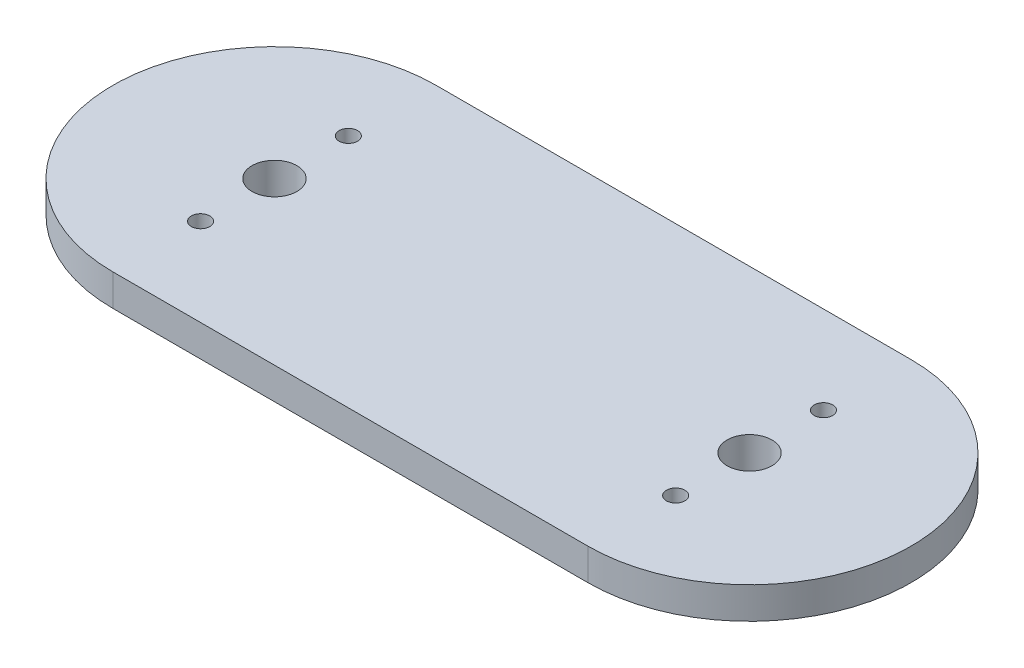
ISO-10303-21;
HEADER;
FILE_DESCRIPTION(('STEP AP214'),'2;1');
FILE_NAME('part.step','',(''),(''),'','','');
FILE_SCHEMA(('AUTOMOTIVE_DESIGN { 1 0 10303 214 1 1 1 1 }'));
ENDSEC;
DATA;
#1=APPLICATION_CONTEXT('core data for automotive mechanical design processes');
#2=APPLICATION_PROTOCOL_DEFINITION('international standard','automotive_design',2000,#1);
#3=PRODUCT_CONTEXT('',#1,'mechanical');
#4=PRODUCT('Part','Part','',(#3));
#5=PRODUCT_RELATED_PRODUCT_CATEGORY('part','',(#4));
#6=PRODUCT_DEFINITION_FORMATION('','',#4);
#7=PRODUCT_DEFINITION_CONTEXT('part definition',#1,'design');
#8=PRODUCT_DEFINITION('design','',#6,#7);
#9=PRODUCT_DEFINITION_SHAPE('','',#8);
#10=(LENGTH_UNIT() NAMED_UNIT(*) SI_UNIT(.MILLI.,.METRE.));
#11=(NAMED_UNIT(*) PLANE_ANGLE_UNIT() SI_UNIT($,.RADIAN.));
#12=(NAMED_UNIT(*) SI_UNIT($,.STERADIAN.) SOLID_ANGLE_UNIT());
#13=UNCERTAINTY_MEASURE_WITH_UNIT(LENGTH_MEASURE(1.E-05),#10,'distance_accuracy_value','');
#14=(GEOMETRIC_REPRESENTATION_CONTEXT(3) GLOBAL_UNCERTAINTY_ASSIGNED_CONTEXT((#13)) GLOBAL_UNIT_ASSIGNED_CONTEXT((#10,
#11,#12)) REPRESENTATION_CONTEXT('',''));
#15=CARTESIAN_POINT('',(0.,0.,0.));
#16=DIRECTION('',(0.,0.,1.));
#17=DIRECTION('',(1.,0.,0.));
#18=AXIS2_PLACEMENT_3D('',#15,#16,#17);
#19=CARTESIAN_POINT('',(-31.9723183391004,3.,15.30530954));
#20=DIRECTION('',(0.,-1.,0.));
#21=DIRECTION('',(0.,0.,-1.));
#22=AXIS2_PLACEMENT_3D('',#19,#20,#21);
#23=CYLINDRICAL_SURFACE('',#22,15.30530954);
#24=CARTESIAN_POINT('',(-31.9723183391004,0.,15.30530954));
#25=DIRECTION('',(0.,1.,0.));
#26=DIRECTION('',(0.,0.,-1.));
#27=AXIS2_PLACEMENT_3D('',#24,#25,#26);
#28=CIRCLE('',#27,15.30530954);
#29=CARTESIAN_POINT('',(-31.9723183391004,0.,0.));
#30=VERTEX_POINT('',#29);
#31=CARTESIAN_POINT('',(-31.9723183391004,0.,30.61061908));
#32=VERTEX_POINT('',#31);
#33=EDGE_CURVE('E107',#30,#32,#28,.T.);
#34=ORIENTED_EDGE('',*,*,#33,.T.);
#35=DIRECTION('',(0.,-1.,0.));
#36=VECTOR('',#35,1.);
#37=CARTESIAN_POINT('',(-31.9723183391004,3.,30.61061908));
#38=LINE('',#37,#36);
#39=CARTESIAN_POINT('',(-31.9723183391004,3.,30.61061908));
#40=VERTEX_POINT('',#39);
#41=EDGE_CURVE('E11',#40,#32,#38,.T.);
#42=ORIENTED_EDGE('',*,*,#41,.F.);
#43=CARTESIAN_POINT('',(-31.9723183391004,3.,15.30530954));
#44=DIRECTION('',(0.,1.,0.));
#45=DIRECTION('',(0.,0.,-1.));
#46=AXIS2_PLACEMENT_3D('',#43,#44,#45);
#47=CIRCLE('',#46,15.30530954);
#48=CARTESIAN_POINT('',(-31.9723183391004,3.,0.));
#49=VERTEX_POINT('',#48);
#50=EDGE_CURVE('E91',#49,#40,#47,.T.);
#51=ORIENTED_EDGE('',*,*,#50,.F.);
#52=DIRECTION('',(0.,-1.,0.));
#53=VECTOR('',#52,1.);
#54=CARTESIAN_POINT('',(-31.9723183391004,3.,0.));
#55=LINE('',#54,#53);
#56=EDGE_CURVE('E103',#49,#30,#55,.T.);
#57=ORIENTED_EDGE('',*,*,#56,.T.);
#58=EDGE_LOOP('',(#34,#42,#51,#57));
#59=FACE_BOUND('',#58,.T.);
#60=ADVANCED_FACE('F39',(#59),#23,.T.);
#61=CARTESIAN_POINT('',(13.0276816608996,3.,30.61061908));
#62=DIRECTION('',(0.,0.,-1.));
#63=DIRECTION('',(-1.,0.,0.));
#64=AXIS2_PLACEMENT_3D('',#61,#62,#63);
#65=PLANE('',#64);
#66=DIRECTION('',(1.,0.,0.));
#67=VECTOR('',#66,1.);
#68=CARTESIAN_POINT('',(13.0276816608996,0.,30.61061908));
#69=LINE('',#68,#67);
#70=CARTESIAN_POINT('',(13.0276816608996,0.,30.61061908));
#71=VERTEX_POINT('',#70);
#72=EDGE_CURVE('E96',#32,#71,#69,.T.);
#73=ORIENTED_EDGE('',*,*,#72,.T.);
#74=DIRECTION('',(0.,-1.,0.));
#75=VECTOR('',#74,1.);
#76=CARTESIAN_POINT('',(13.0276816608996,3.,30.61061908));
#77=LINE('',#76,#75);
#78=CARTESIAN_POINT('',(13.0276816608996,3.,30.61061908));
#79=VERTEX_POINT('',#78);
#80=EDGE_CURVE('E48',#79,#71,#77,.T.);
#81=ORIENTED_EDGE('',*,*,#80,.F.);
#82=DIRECTION('',(1.,0.,0.));
#83=VECTOR('',#82,1.);
#84=CARTESIAN_POINT('',(13.0276816608996,3.,30.61061908));
#85=LINE('',#84,#83);
#86=EDGE_CURVE('E86',#40,#79,#85,.T.);
#87=ORIENTED_EDGE('',*,*,#86,.F.);
#88=ORIENTED_EDGE('',*,*,#41,.T.);
#89=EDGE_LOOP('',(#73,#81,#87,#88));
#90=FACE_BOUND('',#89,.T.);
#91=ADVANCED_FACE('F95',(#90),#65,.F.);
#92=CARTESIAN_POINT('',(13.0276816608996,3.,15.30530954));
#93=DIRECTION('',(0.,-1.,0.));
#94=DIRECTION('',(0.,0.,-1.));
#95=AXIS2_PLACEMENT_3D('',#92,#93,#94);
#96=CYLINDRICAL_SURFACE('',#95,15.30530954);
#97=CARTESIAN_POINT('',(13.0276816608996,0.,15.30530954));
#98=DIRECTION('',(0.,1.,0.));
#99=DIRECTION('',(0.,0.,-1.));
#100=AXIS2_PLACEMENT_3D('',#97,#98,#99);
#101=CIRCLE('',#100,15.30530954);
#102=CARTESIAN_POINT('',(13.0276816608996,0.,0.));
#103=VERTEX_POINT('',#102);
#104=EDGE_CURVE('E73',#71,#103,#101,.T.);
#105=ORIENTED_EDGE('',*,*,#104,.T.);
#106=DIRECTION('',(0.,-1.,0.));
#107=VECTOR('',#106,1.);
#108=CARTESIAN_POINT('',(13.0276816608996,3.,0.));
#109=LINE('',#108,#107);
#110=CARTESIAN_POINT('',(13.0276816608996,3.,0.));
#111=VERTEX_POINT('',#110);
#112=EDGE_CURVE('E98',#111,#103,#109,.T.);
#113=ORIENTED_EDGE('',*,*,#112,.F.);
#114=CARTESIAN_POINT('',(13.0276816608996,3.,15.30530954));
#115=DIRECTION('',(0.,1.,0.));
#116=DIRECTION('',(0.,0.,-1.));
#117=AXIS2_PLACEMENT_3D('',#114,#115,#116);
#118=CIRCLE('',#117,15.30530954);
#119=EDGE_CURVE('E89',#79,#111,#118,.T.);
#120=ORIENTED_EDGE('',*,*,#119,.F.);
#121=ORIENTED_EDGE('',*,*,#80,.T.);
#122=EDGE_LOOP('',(#105,#113,#120,#121));
#123=FACE_BOUND('',#122,.T.);
#124=ADVANCED_FACE('F99',(#123),#96,.T.);
#125=CARTESIAN_POINT('',(-31.9723183391004,3.,0.));
#126=DIRECTION('',(0.,0.,1.));
#127=DIRECTION('',(1.,0.,0.));
#128=AXIS2_PLACEMENT_3D('',#125,#126,#127);
#129=PLANE('',#128);
#130=DIRECTION('',(-1.,0.,0.));
#131=VECTOR('',#130,1.);
#132=CARTESIAN_POINT('',(-31.9723183391004,0.,0.));
#133=LINE('',#132,#131);
#134=EDGE_CURVE('E79',#103,#30,#133,.T.);
#135=ORIENTED_EDGE('',*,*,#134,.T.);
#136=ORIENTED_EDGE('',*,*,#56,.F.);
#137=DIRECTION('',(-1.,0.,0.));
#138=VECTOR('',#137,1.);
#139=CARTESIAN_POINT('',(-31.9723183391004,3.,0.));
#140=LINE('',#139,#138);
#141=EDGE_CURVE('E56',#111,#49,#140,.T.);
#142=ORIENTED_EDGE('',*,*,#141,.F.);
#143=ORIENTED_EDGE('',*,*,#112,.T.);
#144=EDGE_LOOP('',(#135,#136,#142,#143));
#145=FACE_BOUND('',#144,.T.);
#146=ADVANCED_FACE('F121',(#145),#129,.F.);
#147=CARTESIAN_POINT('',(-31.9723183391004,3.,15.30530954));
#148=DIRECTION('',(0.,-1.,0.));
#149=DIRECTION('',(0.,0.,-1.));
#150=AXIS2_PLACEMENT_3D('',#147,#148,#149);
#151=PLANE('',#150);
#152=CARTESIAN_POINT('',(-31.9723183391004,3.,8.30530954));
#153=DIRECTION('',(0.,1.,0.));
#154=DIRECTION('',(0.,0.,1.));
#155=AXIS2_PLACEMENT_3D('',#152,#153,#154);
#156=CIRCLE('',#155,0.875000000000002);
#157=CARTESIAN_POINT('',(-31.9723183391004,3.,9.18030954));
#158=VERTEX_POINT('',#157);
#159=EDGE_CURVE('E161',#158,#158,#156,.T.);
#160=ORIENTED_EDGE('',*,*,#159,.F.);
#161=EDGE_LOOP('',(#160));
#162=FACE_BOUND('',#161,.T.);
#163=CARTESIAN_POINT('',(-31.9723183391004,3.,22.30530954));
#164=DIRECTION('',(0.,1.,0.));
#165=DIRECTION('',(0.,0.,-1.));
#166=AXIS2_PLACEMENT_3D('',#163,#164,#165);
#167=CIRCLE('',#166,0.875000000000002);
#168=CARTESIAN_POINT('',(-31.9723183391004,3.,21.43030954));
#169=VERTEX_POINT('',#168);
#170=EDGE_CURVE('E153',#169,#169,#167,.T.);
#171=ORIENTED_EDGE('',*,*,#170,.F.);
#172=EDGE_LOOP('',(#171));
#173=FACE_BOUND('',#172,.T.);
#174=CARTESIAN_POINT('',(13.0276816608996,3.,8.30530954));
#175=DIRECTION('',(0.,1.,0.));
#176=DIRECTION('',(0.,0.,-1.));
#177=AXIS2_PLACEMENT_3D('',#174,#175,#176);
#178=CIRCLE('',#177,0.875);
#179=CARTESIAN_POINT('',(13.0276816608996,3.,7.43030954));
#180=VERTEX_POINT('',#179);
#181=EDGE_CURVE('E145',#180,#180,#178,.T.);
#182=ORIENTED_EDGE('',*,*,#181,.F.);
#183=EDGE_LOOP('',(#182));
#184=FACE_BOUND('',#183,.T.);
#185=CARTESIAN_POINT('',(13.0276816608996,3.,15.30530954));
#186=DIRECTION('',(0.,1.,0.));
#187=DIRECTION('',(0.,0.,-1.));
#188=AXIS2_PLACEMENT_3D('',#185,#186,#187);
#189=CIRCLE('',#188,2.125);
#190=CARTESIAN_POINT('',(13.0276816608996,3.,13.18030954));
#191=VERTEX_POINT('',#190);
#192=EDGE_CURVE('E136',#191,#191,#189,.T.);
#193=ORIENTED_EDGE('',*,*,#192,.F.);
#194=EDGE_LOOP('',(#193));
#195=FACE_BOUND('',#194,.T.);
#196=CARTESIAN_POINT('',(13.0276816608996,3.,22.30530954));
#197=DIRECTION('',(0.,1.,0.));
#198=DIRECTION('',(0.,0.,1.));
#199=AXIS2_PLACEMENT_3D('',#196,#197,#198);
#200=CIRCLE('',#199,0.875);
#201=CARTESIAN_POINT('',(13.0276816608996,3.,23.18030954));
#202=VERTEX_POINT('',#201);
#203=EDGE_CURVE('E168',#202,#202,#200,.T.);
#204=ORIENTED_EDGE('',*,*,#203,.F.);
#205=EDGE_LOOP('',(#204));
#206=FACE_BOUND('',#205,.T.);
#207=CARTESIAN_POINT('',(-31.9723183391004,3.,15.30530954));
#208=DIRECTION('',(0.,1.,0.));
#209=DIRECTION('',(0.,0.,1.));
#210=AXIS2_PLACEMENT_3D('',#207,#208,#209);
#211=CIRCLE('',#210,2.125);
#212=CARTESIAN_POINT('',(-31.9723183391004,3.,17.43030954));
#213=VERTEX_POINT('',#212);
#214=EDGE_CURVE('E128',#213,#213,#211,.T.);
#215=ORIENTED_EDGE('',*,*,#214,.F.);
#216=EDGE_LOOP('',(#215));
#217=FACE_BOUND('',#216,.T.);
#218=ORIENTED_EDGE('',*,*,#50,.T.);
#219=ORIENTED_EDGE('',*,*,#86,.T.);
#220=ORIENTED_EDGE('',*,*,#119,.T.);
#221=ORIENTED_EDGE('',*,*,#141,.T.);
#222=EDGE_LOOP('',(#218,#219,#220,#221));
#223=FACE_BOUND('',#222,.T.);
#224=ADVANCED_FACE('F87',(#162,#173,#184,#195,#206,#217,#223),#151,.F.);
#225=CARTESIAN_POINT('',(-31.9723183391004,0.,15.30530954));
#226=DIRECTION('',(0.,-1.,0.));
#227=DIRECTION('',(0.,0.,-1.));
#228=AXIS2_PLACEMENT_3D('',#225,#226,#227);
#229=PLANE('',#228);
#230=CARTESIAN_POINT('',(-31.9723183391004,0.,8.30530954));
#231=DIRECTION('',(0.,1.,0.));
#232=DIRECTION('',(0.,0.,1.));
#233=AXIS2_PLACEMENT_3D('',#230,#231,#232);
#234=CIRCLE('',#233,0.875000000000002);
#235=CARTESIAN_POINT('',(-31.9723183391004,0.,9.18030954));
#236=VERTEX_POINT('',#235);
#237=EDGE_CURVE('E132',#236,#236,#234,.T.);
#238=ORIENTED_EDGE('',*,*,#237,.T.);
#239=EDGE_LOOP('',(#238));
#240=FACE_BOUND('',#239,.T.);
#241=CARTESIAN_POINT('',(-31.9723183391004,0.,22.30530954));
#242=DIRECTION('',(0.,1.,0.));
#243=DIRECTION('',(0.,0.,-1.));
#244=AXIS2_PLACEMENT_3D('',#241,#242,#243);
#245=CIRCLE('',#244,0.875000000000002);
#246=CARTESIAN_POINT('',(-31.9723183391004,0.,21.43030954));
#247=VERTEX_POINT('',#246);
#248=EDGE_CURVE('E157',#247,#247,#245,.T.);
#249=ORIENTED_EDGE('',*,*,#248,.T.);
#250=EDGE_LOOP('',(#249));
#251=FACE_BOUND('',#250,.T.);
#252=CARTESIAN_POINT('',(13.0276816608996,0.,8.30530954));
#253=DIRECTION('',(0.,1.,0.));
#254=DIRECTION('',(0.,0.,-1.));
#255=AXIS2_PLACEMENT_3D('',#252,#253,#254);
#256=CIRCLE('',#255,0.875);
#257=CARTESIAN_POINT('',(13.0276816608996,0.,7.43030954));
#258=VERTEX_POINT('',#257);
#259=EDGE_CURVE('E149',#258,#258,#256,.T.);
#260=ORIENTED_EDGE('',*,*,#259,.T.);
#261=EDGE_LOOP('',(#260));
#262=FACE_BOUND('',#261,.T.);
#263=CARTESIAN_POINT('',(13.0276816608996,0.,15.30530954));
#264=DIRECTION('',(0.,1.,0.));
#265=DIRECTION('',(0.,0.,-1.));
#266=AXIS2_PLACEMENT_3D('',#263,#264,#265);
#267=CIRCLE('',#266,2.125);
#268=CARTESIAN_POINT('',(13.0276816608996,0.,13.18030954));
#269=VERTEX_POINT('',#268);
#270=EDGE_CURVE('E140',#269,#269,#267,.T.);
#271=ORIENTED_EDGE('',*,*,#270,.T.);
#272=EDGE_LOOP('',(#271));
#273=FACE_BOUND('',#272,.T.);
#274=CARTESIAN_POINT('',(13.0276816608996,0.,22.30530954));
#275=DIRECTION('',(0.,1.,0.));
#276=DIRECTION('',(0.,0.,1.));
#277=AXIS2_PLACEMENT_3D('',#274,#275,#276);
#278=CIRCLE('',#277,0.875);
#279=CARTESIAN_POINT('',(13.0276816608996,0.,23.18030954));
#280=VERTEX_POINT('',#279);
#281=EDGE_CURVE('E141',#280,#280,#278,.T.);
#282=ORIENTED_EDGE('',*,*,#281,.T.);
#283=EDGE_LOOP('',(#282));
#284=FACE_BOUND('',#283,.T.);
#285=CARTESIAN_POINT('',(-31.9723183391004,0.,15.30530954));
#286=DIRECTION('',(0.,1.,0.));
#287=DIRECTION('',(0.,0.,1.));
#288=AXIS2_PLACEMENT_3D('',#285,#286,#287);
#289=CIRCLE('',#288,2.125);
#290=CARTESIAN_POINT('',(-31.9723183391004,0.,17.43030954));
#291=VERTEX_POINT('',#290);
#292=EDGE_CURVE('E111',#291,#291,#289,.T.);
#293=ORIENTED_EDGE('',*,*,#292,.T.);
#294=EDGE_LOOP('',(#293));
#295=FACE_BOUND('',#294,.T.);
#296=ORIENTED_EDGE('',*,*,#33,.F.);
#297=ORIENTED_EDGE('',*,*,#134,.F.);
#298=ORIENTED_EDGE('',*,*,#104,.F.);
#299=ORIENTED_EDGE('',*,*,#72,.F.);
#300=EDGE_LOOP('',(#296,#297,#298,#299));
#301=FACE_BOUND('',#300,.T.);
#302=ADVANCED_FACE('F124',(#240,#251,#262,#273,#284,#295,#301),#229,.T.);
#303=CARTESIAN_POINT('',(-31.9723183391004,0.,15.30530954));
#304=DIRECTION('',(0.,1.,0.));
#305=DIRECTION('',(0.,0.,1.));
#306=AXIS2_PLACEMENT_3D('',#303,#304,#305);
#307=CYLINDRICAL_SURFACE('',#306,2.125);
#308=ORIENTED_EDGE('',*,*,#292,.F.);
#309=EDGE_LOOP('',(#308));
#310=FACE_BOUND('',#309,.T.);
#311=ORIENTED_EDGE('',*,*,#214,.T.);
#312=EDGE_LOOP('',(#311));
#313=FACE_BOUND('',#312,.T.);
#314=ADVANCED_FACE('F182',(#310,#313),#307,.F.);
#315=CARTESIAN_POINT('',(13.0276816608996,0.,22.30530954));
#316=DIRECTION('',(0.,1.,0.));
#317=DIRECTION('',(0.,0.,1.));
#318=AXIS2_PLACEMENT_3D('',#315,#316,#317);
#319=CYLINDRICAL_SURFACE('',#318,0.875);
#320=ORIENTED_EDGE('',*,*,#281,.F.);
#321=EDGE_LOOP('',(#320));
#322=FACE_BOUND('',#321,.T.);
#323=ORIENTED_EDGE('',*,*,#203,.T.);
#324=EDGE_LOOP('',(#323));
#325=FACE_BOUND('',#324,.T.);
#326=ADVANCED_FACE('F178',(#322,#325),#319,.F.);
#327=CARTESIAN_POINT('',(13.0276816608996,0.,15.30530954));
#328=DIRECTION('',(0.,1.,0.));
#329=DIRECTION('',(0.,0.,1.));
#330=AXIS2_PLACEMENT_3D('',#327,#328,#329);
#331=CYLINDRICAL_SURFACE('',#330,2.125);
#332=ORIENTED_EDGE('',*,*,#270,.F.);
#333=EDGE_LOOP('',(#332));
#334=FACE_BOUND('',#333,.T.);
#335=ORIENTED_EDGE('',*,*,#192,.T.);
#336=EDGE_LOOP('',(#335));
#337=FACE_BOUND('',#336,.T.);
#338=ADVANCED_FACE('F181',(#334,#337),#331,.F.);
#339=CARTESIAN_POINT('',(13.0276816608996,0.,8.30530954));
#340=DIRECTION('',(0.,1.,0.));
#341=DIRECTION('',(0.,0.,1.));
#342=AXIS2_PLACEMENT_3D('',#339,#340,#341);
#343=CYLINDRICAL_SURFACE('',#342,0.875);
#344=ORIENTED_EDGE('',*,*,#259,.F.);
#345=EDGE_LOOP('',(#344));
#346=FACE_BOUND('',#345,.T.);
#347=ORIENTED_EDGE('',*,*,#181,.T.);
#348=EDGE_LOOP('',(#347));
#349=FACE_BOUND('',#348,.T.);
#350=ADVANCED_FACE('F243',(#346,#349),#343,.F.);
#351=CARTESIAN_POINT('',(-31.9723183391004,0.,22.30530954));
#352=DIRECTION('',(0.,1.,0.));
#353=DIRECTION('',(0.,0.,1.));
#354=AXIS2_PLACEMENT_3D('',#351,#352,#353);
#355=CYLINDRICAL_SURFACE('',#354,0.875000000000002);
#356=ORIENTED_EDGE('',*,*,#248,.F.);
#357=EDGE_LOOP('',(#356));
#358=FACE_BOUND('',#357,.T.);
#359=ORIENTED_EDGE('',*,*,#170,.T.);
#360=EDGE_LOOP('',(#359));
#361=FACE_BOUND('',#360,.T.);
#362=ADVANCED_FACE('F252',(#358,#361),#355,.F.);
#363=CARTESIAN_POINT('',(-31.9723183391004,0.,8.30530954));
#364=DIRECTION('',(0.,1.,0.));
#365=DIRECTION('',(0.,0.,1.));
#366=AXIS2_PLACEMENT_3D('',#363,#364,#365);
#367=CYLINDRICAL_SURFACE('',#366,0.875000000000002);
#368=ORIENTED_EDGE('',*,*,#237,.F.);
#369=EDGE_LOOP('',(#368));
#370=FACE_BOUND('',#369,.T.);
#371=ORIENTED_EDGE('',*,*,#159,.T.);
#372=EDGE_LOOP('',(#371));
#373=FACE_BOUND('',#372,.T.);
#374=ADVANCED_FACE('F262',(#370,#373),#367,.F.);
#375=CLOSED_SHELL('',(#60,#91,#124,#146,#224,#302,#314,#326,#338,#350,#362,#374));
#376=MANIFOLD_SOLID_BREP('B2',#375);
#377=ADVANCED_BREP_SHAPE_REPRESENTATION('',(#18,#376),#14);
#378=SHAPE_DEFINITION_REPRESENTATION(#9,#377);
ENDSEC;
END-ISO-10303-21;
